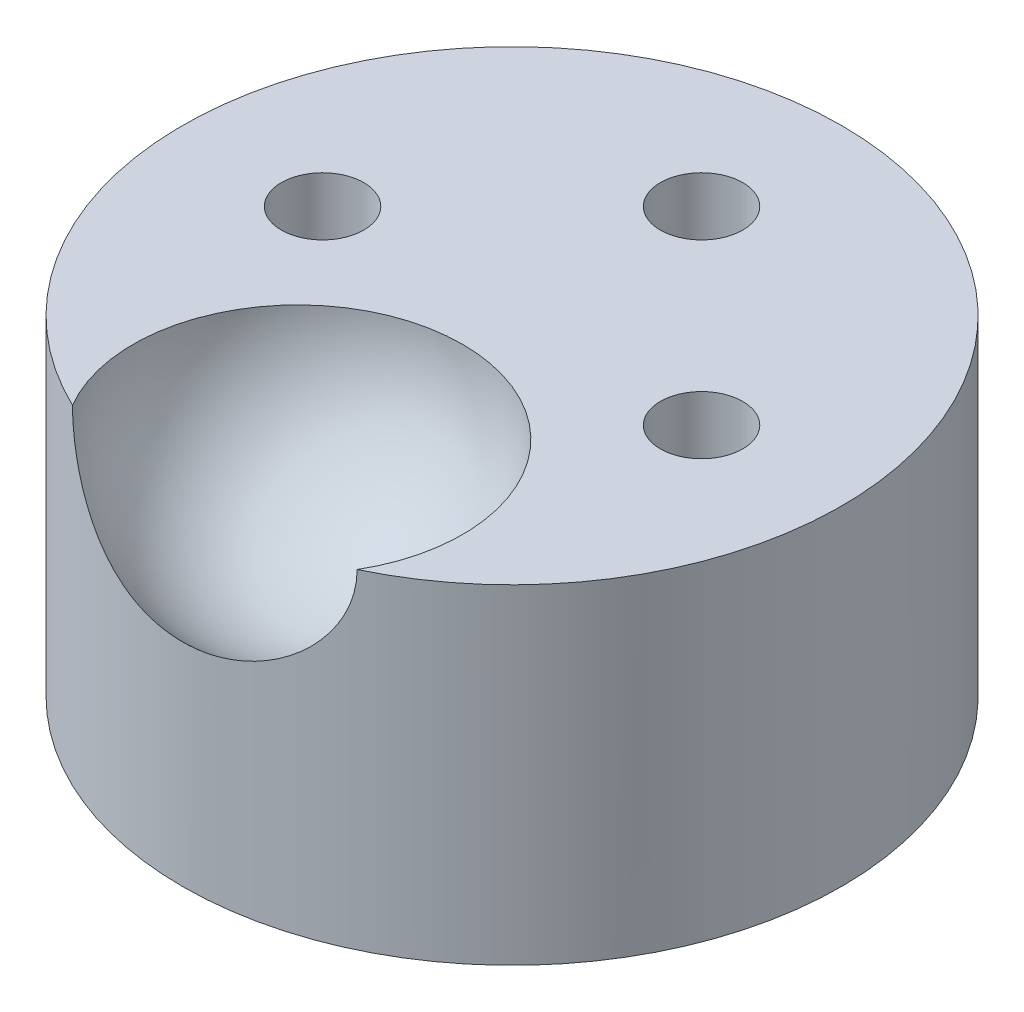
ISO-10303-21;
HEADER;
FILE_DESCRIPTION(('STEP AP214'),'2;1');
FILE_NAME('part.step','',(''),(''),'','','');
FILE_SCHEMA(('AUTOMOTIVE_DESIGN { 1 0 10303 214 1 1 1 1 }'));
ENDSEC;
DATA;
#1=APPLICATION_CONTEXT('core data for automotive mechanical design processes');
#2=APPLICATION_PROTOCOL_DEFINITION('international standard','automotive_design',2000,#1);
#3=PRODUCT_CONTEXT('',#1,'mechanical');
#4=PRODUCT('Part','Part','',(#3));
#5=PRODUCT_RELATED_PRODUCT_CATEGORY('part','',(#4));
#6=PRODUCT_DEFINITION_FORMATION('','',#4);
#7=PRODUCT_DEFINITION_CONTEXT('part definition',#1,'design');
#8=PRODUCT_DEFINITION('design','',#6,#7);
#9=PRODUCT_DEFINITION_SHAPE('','',#8);
#10=(LENGTH_UNIT() NAMED_UNIT(*) SI_UNIT(.MILLI.,.METRE.));
#11=(NAMED_UNIT(*) PLANE_ANGLE_UNIT() SI_UNIT($,.RADIAN.));
#12=(NAMED_UNIT(*) SI_UNIT($,.STERADIAN.) SOLID_ANGLE_UNIT());
#13=UNCERTAINTY_MEASURE_WITH_UNIT(LENGTH_MEASURE(1.E-05),#10,'distance_accuracy_value','');
#14=(GEOMETRIC_REPRESENTATION_CONTEXT(3) GLOBAL_UNCERTAINTY_ASSIGNED_CONTEXT((#13)) GLOBAL_UNIT_ASSIGNED_CONTEXT((#10,
#11,#12)) REPRESENTATION_CONTEXT('',''));
#15=CARTESIAN_POINT('',(0.,0.,0.));
#16=DIRECTION('',(0.,0.,1.));
#17=DIRECTION('',(1.,0.,0.));
#18=AXIS2_PLACEMENT_3D('',#15,#16,#17);
#19=CARTESIAN_POINT('',(0.,20.,0.));
#20=DIRECTION('',(0.,-1.,0.));
#21=DIRECTION('',(0.,0.,-1.));
#22=AXIS2_PLACEMENT_3D('',#19,#20,#21);
#23=CYLINDRICAL_SURFACE('',#22,20.);
#24=CARTESIAN_POINT('',(0.,20.,0.));
#25=DIRECTION('',(0.,1.,0.));
#26=DIRECTION('',(0.,0.,1.));
#27=AXIS2_PLACEMENT_3D('',#24,#25,#26);
#28=CIRCLE('',#27,20.);
#29=CARTESIAN_POINT('',(8.63793408897311,20.,18.0384615384615));
#30=VERTEX_POINT('',#29);
#31=CARTESIAN_POINT('',(-8.63793408897312,20.,18.0384615384615));
#32=VERTEX_POINT('',#31);
#33=EDGE_CURVE('E54',#30,#32,#28,.T.);
#34=ORIENTED_EDGE('',*,*,#33,.F.);
#35=CARTESIAN_POINT('',(8.63793408576037,20.0002,18.03846154));
#36=CARTESIAN_POINT('',(8.63798782610984,19.8176301358421,18.0384088876324));
#37=CARTESIAN_POINT('',(8.62991683612189,19.6350890562003,18.0423000992443));
#38=CARTESIAN_POINT('',(8.59788775379905,19.2718519671144,18.0575994662564));
#39=CARTESIAN_POINT('',(8.57394114378896,19.0911547199265,18.0690021887846));
#40=CARTESIAN_POINT('',(8.51076369559862,18.7344873649878,18.0988407355018));
#41=CARTESIAN_POINT('',(8.47165063158374,18.5584917388694,18.1172223431727));
#42=CARTESIAN_POINT('',(8.37875787115226,18.2112108681917,18.160370373185));
#43=CARTESIAN_POINT('',(8.32497643895175,18.039926183745,18.1851375511449));
#44=CARTESIAN_POINT('',(8.20369040085638,17.7037732576968,18.2401719548513));
#45=CARTESIAN_POINT('',(8.13622460916656,17.5388884055078,18.2704235992871));
#46=CARTESIAN_POINT('',(7.98831805738252,17.2159309188068,18.3355748681974));
#47=CARTESIAN_POINT('',(7.90787147764849,17.057861380253,18.3704765761925));
#48=CARTESIAN_POINT('',(7.73484154491035,16.7491852361011,18.4439978770986));
#49=CARTESIAN_POINT('',(7.6422446550102,16.5985872164464,18.4826216038433));
#50=CARTESIAN_POINT('',(7.44590768094994,16.3055708485906,18.5625894106956));
#51=CARTESIAN_POINT('',(7.34216323541593,16.1631557355616,18.6039345530619));
#52=CARTESIAN_POINT('',(7.00950573760684,15.7411430842849,18.7329716883214));
#53=CARTESIAN_POINT('',(6.76399313080228,15.4753003334698,18.8235487763619));
#54=CARTESIAN_POINT('',(6.23728978484036,14.9820466730398,19.0045709566868));
#55=CARTESIAN_POINT('',(5.95609557280484,14.754639509378,19.0950160352549));
#56=CARTESIAN_POINT('',(5.48465345295501,14.422993837292,19.2341455506596));
#57=CARTESIAN_POINT('',(5.30369948114966,14.3061744055309,19.2849068014069));
#58=CARTESIAN_POINT('',(4.93274723214557,14.0862147949806,19.383105284505));
#59=CARTESIAN_POINT('',(4.74274805149141,13.9830759865541,19.4305421836376));
#60=CARTESIAN_POINT('',(4.35487326526916,13.7904240648905,19.5211366814866));
#61=CARTESIAN_POINT('',(4.15699369216466,13.7009179275457,19.5642920854335));
#62=CARTESIAN_POINT('',(3.75459654812121,13.5355211064414,19.6454865401959));
#63=CARTESIAN_POINT('',(3.5500784170602,13.4596315751149,19.6835251578872));
#64=CARTESIAN_POINT('',(3.1071467282501,13.3119437285131,19.7586119046287));
#65=CARTESIAN_POINT('',(2.86792588287516,13.242127789606,19.7948115322718));
#66=CARTESIAN_POINT('',(2.38397466332174,13.1199302759572,19.8589088563032));
#67=CARTESIAN_POINT('',(2.13924382437981,13.0675501778409,19.8868058495278));
#68=CARTESIAN_POINT('',(1.64579544337013,12.980144598442,19.9337099399935));
#69=CARTESIAN_POINT('',(1.39707685745382,12.9451237403567,19.9527146689281));
#70=CARTESIAN_POINT('',(0.897281004651234,12.8924071841464,19.981430144763));
#71=CARTESIAN_POINT('',(0.646203702628745,12.8747117445212,19.9911407529926));
#72=CARTESIAN_POINT('',(0.127283899389208,12.856047035219,20.0013831618722));
#73=CARTESIAN_POINT('',(-0.140612442320315,12.8562091473641,20.0012940953999));
#74=CARTESIAN_POINT('',(-0.675469095256185,12.8760979050308,19.9903801746893));
#75=CARTESIAN_POINT('',(-0.942429356812792,12.8958255734234,19.9795547591636));
#76=CARTESIAN_POINT('',(-1.4736275367887,12.9548893598652,19.9474119311848));
#77=CARTESIAN_POINT('',(-1.73786453310454,12.9942319104354,19.9260910768775));
#78=CARTESIAN_POINT('',(-2.26163880112046,13.0925921511112,19.8734563210459));
#79=CARTESIAN_POINT('',(-2.5211761611192,13.1516094711539,19.8421426074778));
#80=CARTESIAN_POINT('',(-3.0355937681829,13.2899347078282,19.7700059298632));
#81=CARTESIAN_POINT('',(-3.29042377076613,13.3693931073245,19.7291126517695));
#82=CARTESIAN_POINT('',(-3.79140159119097,13.5485008513994,19.6389930880622));
#83=CARTESIAN_POINT('',(-4.03754878171879,13.6481516513402,19.5897662018481));
#84=CARTESIAN_POINT('',(-4.51896007719952,13.867707376821,19.4843448712801));
#85=CARTESIAN_POINT('',(-4.75422896580822,13.9876032897125,19.4281535302859));
#86=CARTESIAN_POINT('',(-5.21179540278263,14.2477597804706,19.3104365098641));
#87=CARTESIAN_POINT('',(-5.43409597768818,14.3880155798854,19.2489120834694));
#88=CARTESIAN_POINT('',(-5.82032677824585,14.6586888489659,19.1351987297124));
#89=CARTESIAN_POINT('',(-5.98701870692383,14.7854330306658,19.0836138292746));
#90=CARTESIAN_POINT('',(-6.3093808684712,15.0518655348456,18.9794727177815));
#91=CARTESIAN_POINT('',(-6.46505299805051,15.1915516201834,18.926916675851));
#92=CARTESIAN_POINT('',(-6.76392337667082,15.4835919503342,18.822178466678));
#93=CARTESIAN_POINT('',(-6.90713155048397,15.6359359234475,18.7699960328987));
#94=CARTESIAN_POINT('',(-7.17976690796791,15.9530558674581,18.6674089495916));
#95=CARTESIAN_POINT('',(-7.30919628599894,16.1178298516346,18.6170040178432));
#96=CARTESIAN_POINT('',(-7.53242319802574,16.4307367556257,18.527669963821));
#97=CARTESIAN_POINT('',(-7.62856220463172,16.5770564402104,18.4882296935293));
#98=CARTESIAN_POINT('',(-7.80931667281572,16.8774403932647,18.4126089930049));
#99=CARTESIAN_POINT('',(-7.89393427680057,17.0315032145818,18.3764279571417));
#100=CARTESIAN_POINT('',(-8.05064145065533,17.3465102706415,18.3083168950122));
#101=CARTESIAN_POINT('',(-8.12274841419381,17.5074445573809,18.2763809814035));
#102=CARTESIAN_POINT('',(-8.25367198940796,17.8354551268328,18.2176302364179));
#103=CARTESIAN_POINT('',(-8.31249597768322,18.0025279403208,18.190812563952));
#104=CARTESIAN_POINT('',(-8.40908042364464,18.3187950384541,18.1463439298861));
#105=CARTESIAN_POINT('',(-8.44861504997553,18.4673439190128,18.1279432272217));
#106=CARTESIAN_POINT('',(-8.51675945430219,18.767427891617,18.0960276754116));
#107=CARTESIAN_POINT('',(-8.5453711036666,18.9189624674586,18.0825119893662));
#108=CARTESIAN_POINT('',(-8.59144677046245,19.2248668926261,18.0606681911252));
#109=CARTESIAN_POINT('',(-8.60885463746467,19.3792470948649,18.0523662136261));
#110=CARTESIAN_POINT('',(-8.63211636298696,19.6891466651436,18.0412470555497));
#111=CARTESIAN_POINT('',(-8.63796448927846,19.8446665599875,18.0384325961249));
#112=CARTESIAN_POINT('',(-8.63793408576037,20.0002,18.03846154));
#113=B_SPLINE_CURVE_WITH_KNOTS('',3,(#35,#36,#37,#38,#39,#40,#41,#42,#43,#44,#45,#46,#47,#48,
#49,#50,#51,#52,#53,#54,#55,#56,#57,#58,#59,#60,#61,#62,#63,#64,#65,#66,#67,#68,#69,#70,#71,#72,
#73,#74,#75,#76,#77,#78,#79,#80,#81,#82,#83,#84,#85,#86,#87,#88,#89,#90,#91,#92,#93,#94,#95,#96,
#97,#98,#99,#100,#101,#102,#103,#104,#105,#106,#107,#108,#109,#110,#111,#112),.UNSPECIFIED.,.F.,
.F.,(4,2,2,2,2,2,2,2,2,2,2,2,2,2,2,2,2,2,2,2,2,2,2,2,2,2,2,2,2,2,2,2,2,2,2,2,2,2,4),(0.,
0.547443834171976,1.09449215118353,1.63737482997191,2.18032177877009,2.72174972767708,
3.26342109133576,3.80570114850077,4.34819414538649,5.46291979354796,6.57775402090519,
7.24104528154342,7.90440293274832,8.56809889449773,9.23185100127792,9.98647068851286,
10.7411542675492,11.4960387297364,12.2509344548212,13.0536831975525,13.8564739095307,
14.6595280627216,15.4625671121183,16.2716961398314,17.0808835060775,17.8897115862849,
18.698350141077,19.3447250793084,19.9909884926579,20.6367325004943,21.2823735151913,
21.820244438746,22.3580152081171,22.8950322114736,23.4317502490191,23.8957342540432,
24.3596387317373,24.8258504364257,25.2922932676029),.UNSPECIFIED.);
#114=EDGE_CURVE('E46',#30,#32,#113,.T.);
#115=ORIENTED_EDGE('',*,*,#114,.T.);
#116=EDGE_LOOP('',(#34,#115));
#117=FACE_BOUND('',#116,.T.);
#118=CARTESIAN_POINT('',(0.,0.,0.));
#119=DIRECTION('',(0.,1.,0.));
#120=DIRECTION('',(0.,0.,1.));
#121=AXIS2_PLACEMENT_3D('',#118,#119,#120);
#122=CIRCLE('',#121,20.);
#123=CARTESIAN_POINT('',(0.,0.,20.));
#124=VERTEX_POINT('',#123);
#125=EDGE_CURVE('E58',#124,#124,#122,.T.);
#126=ORIENTED_EDGE('',*,*,#125,.T.);
#127=EDGE_LOOP('',(#126));
#128=FACE_BOUND('',#127,.T.);
#129=ADVANCED_FACE('F32',(#117,#128),#23,.T.);
#130=CARTESIAN_POINT('',(0.,20.,0.));
#131=DIRECTION('',(0.,1.,0.));
#132=DIRECTION('',(0.,0.,1.));
#133=AXIS2_PLACEMENT_3D('',#130,#131,#132);
#134=PLANE('',#133);
#135=CARTESIAN_POINT('',(-11.5,20.,0.));
#136=DIRECTION('',(0.,1.,0.));
#137=DIRECTION('',(0.,0.,1.));
#138=AXIS2_PLACEMENT_3D('',#135,#136,#137);
#139=CIRCLE('',#138,2.5);
#140=CARTESIAN_POINT('',(-11.5,20.,2.5));
#141=VERTEX_POINT('',#140);
#142=EDGE_CURVE('E129',#141,#141,#139,.T.);
#143=ORIENTED_EDGE('',*,*,#142,.F.);
#144=EDGE_LOOP('',(#143));
#145=FACE_BOUND('',#144,.T.);
#146=CARTESIAN_POINT('',(11.5,20.,0.));
#147=DIRECTION('',(0.,1.,0.));
#148=DIRECTION('',(0.,0.,1.));
#149=AXIS2_PLACEMENT_3D('',#146,#147,#148);
#150=CIRCLE('',#149,2.5);
#151=CARTESIAN_POINT('',(11.5,20.,2.5));
#152=VERTEX_POINT('',#151);
#153=EDGE_CURVE('E130',#152,#152,#150,.T.);
#154=ORIENTED_EDGE('',*,*,#153,.F.);
#155=EDGE_LOOP('',(#154));
#156=FACE_BOUND('',#155,.T.);
#157=CARTESIAN_POINT('',(0.,20.,-11.5));
#158=DIRECTION('',(0.,1.,0.));
#159=DIRECTION('',(0.,0.,1.));
#160=AXIS2_PLACEMENT_3D('',#157,#158,#159);
#161=CIRCLE('',#160,2.5);
#162=CARTESIAN_POINT('',(0.,20.,-9.));
#163=VERTEX_POINT('',#162);
#164=EDGE_CURVE('E59',#163,#163,#161,.T.);
#165=ORIENTED_EDGE('',*,*,#164,.F.);
#166=EDGE_LOOP('',(#165));
#167=FACE_BOUND('',#166,.T.);
#168=CARTESIAN_POINT('',(0.,20.,13.));
#169=DIRECTION('',(0.,1.,0.));
#170=DIRECTION('',(0.,0.,1.));
#171=AXIS2_PLACEMENT_3D('',#168,#169,#170);
#172=CIRCLE('',#171,10.);
#173=EDGE_CURVE('E48',#30,#32,#172,.T.);
#174=ORIENTED_EDGE('',*,*,#173,.F.);
#175=ORIENTED_EDGE('',*,*,#33,.T.);
#176=EDGE_LOOP('',(#174,#175));
#177=FACE_BOUND('',#176,.T.);
#178=ADVANCED_FACE('F61',(#145,#156,#167,#177),#134,.T.);
#179=CARTESIAN_POINT('',(0.,0.,0.));
#180=DIRECTION('',(0.,1.,0.));
#181=DIRECTION('',(0.,0.,1.));
#182=AXIS2_PLACEMENT_3D('',#179,#180,#181);
#183=PLANE('',#182);
#184=CARTESIAN_POINT('',(-11.5,0.,0.));
#185=DIRECTION('',(0.,1.,0.));
#186=DIRECTION('',(0.,0.,1.));
#187=AXIS2_PLACEMENT_3D('',#184,#185,#186);
#188=CIRCLE('',#187,4.50000000000002);
#189=CARTESIAN_POINT('',(-11.5,0.,4.50000000000002));
#190=VERTEX_POINT('',#189);
#191=EDGE_CURVE('E80',#190,#190,#188,.T.);
#192=ORIENTED_EDGE('',*,*,#191,.T.);
#193=EDGE_LOOP('',(#192));
#194=FACE_BOUND('',#193,.T.);
#195=CARTESIAN_POINT('',(0.,0.,-11.5));
#196=DIRECTION('',(0.,1.,0.));
#197=DIRECTION('',(0.,0.,1.));
#198=AXIS2_PLACEMENT_3D('',#195,#196,#197);
#199=CIRCLE('',#198,4.50000000000002);
#200=CARTESIAN_POINT('',(0.,0.,-6.99999999999998));
#201=VERTEX_POINT('',#200);
#202=EDGE_CURVE('E77',#201,#201,#199,.T.);
#203=ORIENTED_EDGE('',*,*,#202,.T.);
#204=EDGE_LOOP('',(#203));
#205=FACE_BOUND('',#204,.T.);
#206=CARTESIAN_POINT('',(11.5,0.,0.));
#207=DIRECTION('',(0.,1.,0.));
#208=DIRECTION('',(0.,0.,1.));
#209=AXIS2_PLACEMENT_3D('',#206,#207,#208);
#210=CIRCLE('',#209,4.50000000000002);
#211=CARTESIAN_POINT('',(11.5,0.,4.50000000000002));
#212=VERTEX_POINT('',#211);
#213=EDGE_CURVE('E74',#212,#212,#210,.T.);
#214=ORIENTED_EDGE('',*,*,#213,.T.);
#215=EDGE_LOOP('',(#214));
#216=FACE_BOUND('',#215,.T.);
#217=ORIENTED_EDGE('',*,*,#125,.F.);
#218=EDGE_LOOP('',(#217));
#219=FACE_BOUND('',#218,.T.);
#220=ADVANCED_FACE('F105',(#194,#205,#216,#219),#183,.F.);
#221=CARTESIAN_POINT('',(0.,20.,13.));
#222=DIRECTION('',(0.,0.,-1.));
#223=DIRECTION('',(1.,0.,0.));
#224=AXIS2_PLACEMENT_3D('',#221,#222,#223);
#225=SPHERICAL_SURFACE('',#224,10.);
#226=ORIENTED_EDGE('',*,*,#173,.T.);
#227=ORIENTED_EDGE('',*,*,#114,.F.);
#228=EDGE_LOOP('',(#226,#227));
#229=FACE_BOUND('',#228,.T.);
#230=ADVANCED_FACE('F49',(#229),#225,.F.);
#231=CARTESIAN_POINT('',(0.,20.5822274654653,-11.5));
#232=DIRECTION('',(0.,-1.,0.));
#233=DIRECTION('',(0.,0.,-1.));
#234=AXIS2_PLACEMENT_3D('',#231,#232,#233);
#235=CYLINDRICAL_SURFACE('',#234,2.5);
#236=CARTESIAN_POINT('',(0.,1.15470053837925,-11.5));
#237=DIRECTION('',(0.,1.,0.));
#238=DIRECTION('',(0.,0.,1.));
#239=AXIS2_PLACEMENT_3D('',#236,#237,#238);
#240=CIRCLE('',#239,2.5);
#241=CARTESIAN_POINT('',(0.,1.15470053837925,-9.));
#242=VERTEX_POINT('',#241);
#243=EDGE_CURVE('E40',#242,#242,#240,.F.);
#244=ORIENTED_EDGE('',*,*,#243,.T.);
#245=EDGE_LOOP('',(#244));
#246=FACE_BOUND('',#245,.T.);
#247=ORIENTED_EDGE('',*,*,#164,.T.);
#248=EDGE_LOOP('',(#247));
#249=FACE_BOUND('',#248,.T.);
#250=ADVANCED_FACE('F85',(#246,#249),#235,.F.);
#251=CARTESIAN_POINT('',(11.5,20.5822274654653,0.));
#252=DIRECTION('',(0.,-1.,0.));
#253=DIRECTION('',(0.,0.,-1.));
#254=AXIS2_PLACEMENT_3D('',#251,#252,#253);
#255=CYLINDRICAL_SURFACE('',#254,2.5);
#256=CARTESIAN_POINT('',(11.5,1.15470053837926,0.));
#257=DIRECTION('',(0.,1.,0.));
#258=DIRECTION('',(0.,0.,1.));
#259=AXIS2_PLACEMENT_3D('',#256,#257,#258);
#260=CIRCLE('',#259,2.5);
#261=CARTESIAN_POINT('',(11.5,1.15470053837926,2.5));
#262=VERTEX_POINT('',#261);
#263=EDGE_CURVE('E11',#262,#262,#260,.F.);
#264=ORIENTED_EDGE('',*,*,#263,.T.);
#265=EDGE_LOOP('',(#264));
#266=FACE_BOUND('',#265,.T.);
#267=ORIENTED_EDGE('',*,*,#153,.T.);
#268=EDGE_LOOP('',(#267));
#269=FACE_BOUND('',#268,.T.);
#270=ADVANCED_FACE('F117',(#266,#269),#255,.F.);
#271=CARTESIAN_POINT('',(-11.5,20.5822274654653,0.));
#272=DIRECTION('',(0.,-1.,0.));
#273=DIRECTION('',(0.,0.,-1.));
#274=AXIS2_PLACEMENT_3D('',#271,#272,#273);
#275=CYLINDRICAL_SURFACE('',#274,2.5);
#276=CARTESIAN_POINT('',(-11.5,1.15470053837926,0.));
#277=DIRECTION('',(0.,1.,0.));
#278=DIRECTION('',(0.,0.,1.));
#279=AXIS2_PLACEMENT_3D('',#276,#277,#278);
#280=CIRCLE('',#279,2.5);
#281=CARTESIAN_POINT('',(-11.5,1.15470053837926,2.5));
#282=VERTEX_POINT('',#281);
#283=EDGE_CURVE('E53',#282,#282,#280,.F.);
#284=ORIENTED_EDGE('',*,*,#283,.T.);
#285=EDGE_LOOP('',(#284));
#286=FACE_BOUND('',#285,.T.);
#287=ORIENTED_EDGE('',*,*,#142,.T.);
#288=EDGE_LOOP('',(#287));
#289=FACE_BOUND('',#288,.T.);
#290=ADVANCED_FACE('F97',(#286,#289),#275,.F.);
#291=CARTESIAN_POINT('',(-11.5,1.15470053837926,0.));
#292=DIRECTION('',(0.,-1.,0.));
#293=DIRECTION('',(0.,0.,-1.));
#294=AXIS2_PLACEMENT_3D('',#291,#292,#293);
#295=CONICAL_SURFACE('',#294,2.5,1.0471975511966);
#296=ORIENTED_EDGE('',*,*,#191,.F.);
#297=EDGE_LOOP('',(#296));
#298=FACE_BOUND('',#297,.T.);
#299=ORIENTED_EDGE('',*,*,#283,.F.);
#300=EDGE_LOOP('',(#299));
#301=FACE_BOUND('',#300,.T.);
#302=ADVANCED_FACE('F90',(#298,#301),#295,.F.);
#303=CARTESIAN_POINT('',(0.,1.15470053837925,-11.5));
#304=DIRECTION('',(0.,-1.,0.));
#305=DIRECTION('',(0.,0.,-1.));
#306=AXIS2_PLACEMENT_3D('',#303,#304,#305);
#307=CONICAL_SURFACE('',#306,2.5,1.0471975511966);
#308=ORIENTED_EDGE('',*,*,#202,.F.);
#309=EDGE_LOOP('',(#308));
#310=FACE_BOUND('',#309,.T.);
#311=ORIENTED_EDGE('',*,*,#243,.F.);
#312=EDGE_LOOP('',(#311));
#313=FACE_BOUND('',#312,.T.);
#314=ADVANCED_FACE('F88',(#310,#313),#307,.F.);
#315=CARTESIAN_POINT('',(11.5,1.15470053837926,0.));
#316=DIRECTION('',(0.,-1.,0.));
#317=DIRECTION('',(0.,0.,-1.));
#318=AXIS2_PLACEMENT_3D('',#315,#316,#317);
#319=CONICAL_SURFACE('',#318,2.5,1.0471975511966);
#320=ORIENTED_EDGE('',*,*,#213,.F.);
#321=EDGE_LOOP('',(#320));
#322=FACE_BOUND('',#321,.T.);
#323=ORIENTED_EDGE('',*,*,#263,.F.);
#324=EDGE_LOOP('',(#323));
#325=FACE_BOUND('',#324,.T.);
#326=ADVANCED_FACE('F34',(#322,#325),#319,.F.);
#327=CLOSED_SHELL('',(#129,#178,#220,#230,#250,#270,#290,#302,#314,#326));
#328=MANIFOLD_SOLID_BREP('B2',#327);
#329=ADVANCED_BREP_SHAPE_REPRESENTATION('',(#18,#328),#14);
#330=SHAPE_DEFINITION_REPRESENTATION(#9,#329);
ENDSEC;
END-ISO-10303-21;
